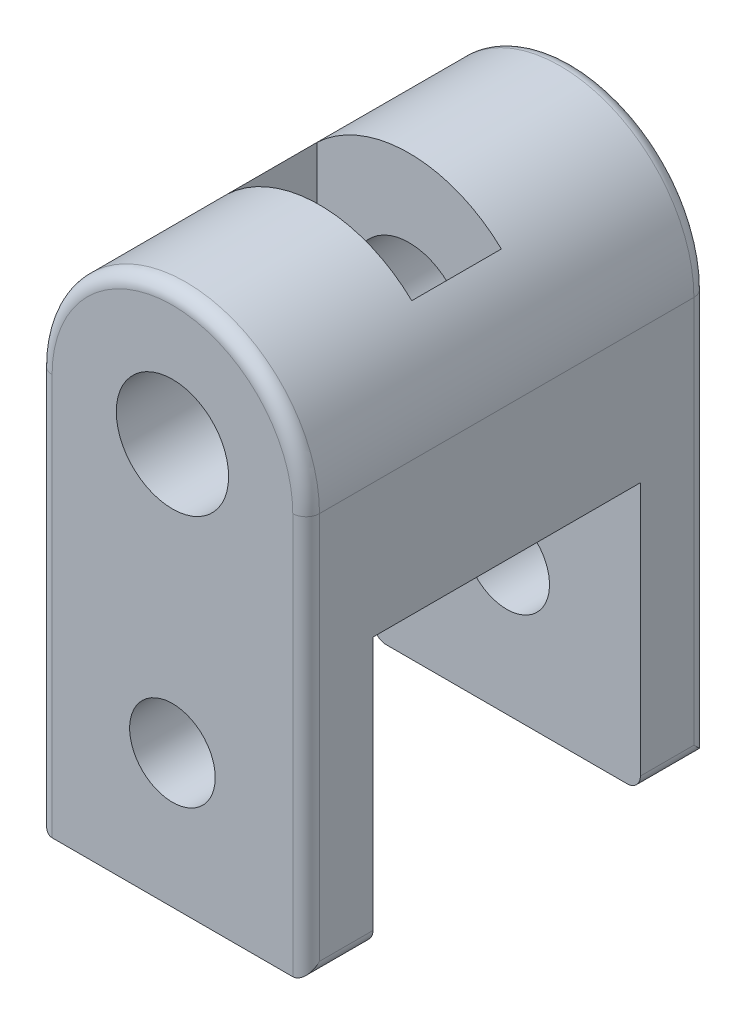
ISO-10303-21;
HEADER;
FILE_DESCRIPTION(('STEP AP214'),'2;1');
FILE_NAME('part.step','',(''),(''),'','','');
FILE_SCHEMA(('AUTOMOTIVE_DESIGN { 1 0 10303 214 1 1 1 1 }'));
ENDSEC;
DATA;
#1=APPLICATION_CONTEXT('core data for automotive mechanical design processes');
#2=APPLICATION_PROTOCOL_DEFINITION('international standard','automotive_design',2000,#1);
#3=PRODUCT_CONTEXT('',#1,'mechanical');
#4=PRODUCT('Part','Part','',(#3));
#5=PRODUCT_RELATED_PRODUCT_CATEGORY('part','',(#4));
#6=PRODUCT_DEFINITION_FORMATION('','',#4);
#7=PRODUCT_DEFINITION_CONTEXT('part definition',#1,'design');
#8=PRODUCT_DEFINITION('design','',#6,#7);
#9=PRODUCT_DEFINITION_SHAPE('','',#8);
#10=(LENGTH_UNIT() NAMED_UNIT(*) SI_UNIT(.MILLI.,.METRE.));
#11=(NAMED_UNIT(*) PLANE_ANGLE_UNIT() SI_UNIT($,.RADIAN.));
#12=(NAMED_UNIT(*) SI_UNIT($,.STERADIAN.) SOLID_ANGLE_UNIT());
#13=UNCERTAINTY_MEASURE_WITH_UNIT(LENGTH_MEASURE(1.E-05),#10,'distance_accuracy_value','');
#14=(GEOMETRIC_REPRESENTATION_CONTEXT(3) GLOBAL_UNCERTAINTY_ASSIGNED_CONTEXT((#13)) GLOBAL_UNIT_ASSIGNED_CONTEXT((#10,
#11,#12)) REPRESENTATION_CONTEXT('',''));
#15=CARTESIAN_POINT('',(0.,0.,0.));
#16=DIRECTION('',(0.,0.,1.));
#17=DIRECTION('',(1.,0.,0.));
#18=AXIS2_PLACEMENT_3D('',#15,#16,#17);
#19=CARTESIAN_POINT('',(6.89726919179015,16.0135523343817,-20.));
#20=DIRECTION('',(0.5,-0.866025403784439,0.));
#21=DIRECTION('',(0.866025403784439,0.5,0.));
#22=AXIS2_PLACEMENT_3D('',#19,#20,#21);
#23=PLANE('',#22);
#24=DIRECTION('',(-0.866025403784439,-0.5,0.));
#25=VECTOR('',#24,1.);
#26=CARTESIAN_POINT('',(-0.00273080820985521,12.0298354769733,-12.7));
#27=LINE('',#26,#25);
#28=CARTESIAN_POINT('',(6.89726919179015,16.0135523343817,-12.7));
#29=VERTEX_POINT('',#28);
#30=CARTESIAN_POINT('',(-0.00273080820985521,12.0298354769733,-12.7));
#31=VERTEX_POINT('',#30);
#32=EDGE_CURVE('E172',#29,#31,#27,.T.);
#33=ORIENTED_EDGE('',*,*,#32,.T.);
#34=DIRECTION('',(0.,0.,1.));
#35=VECTOR('',#34,1.);
#36=CARTESIAN_POINT('',(-0.00273080820985521,12.0298354769733,-20.));
#37=LINE('',#36,#35);
#38=CARTESIAN_POINT('',(-0.00273080820985521,12.0298354769733,-6.));
#39=VERTEX_POINT('',#38);
#40=EDGE_CURVE('E346',#31,#39,#37,.T.);
#41=ORIENTED_EDGE('',*,*,#40,.T.);
#42=DIRECTION('',(-0.866025403784439,-0.5,0.));
#43=VECTOR('',#42,1.);
#44=CARTESIAN_POINT('',(6.89726919179015,16.0135523343817,-6.));
#45=LINE('',#44,#43);
#46=CARTESIAN_POINT('',(6.89726919179015,16.0135523343817,-6.));
#47=VERTEX_POINT('',#46);
#48=EDGE_CURVE('E194',#47,#39,#45,.T.);
#49=ORIENTED_EDGE('',*,*,#48,.F.);
#50=DIRECTION('',(0.,0.,1.));
#51=VECTOR('',#50,1.);
#52=CARTESIAN_POINT('',(6.89726919179015,16.0135523343817,-20.));
#53=LINE('',#52,#51);
#54=EDGE_CURVE('E187',#29,#47,#53,.T.);
#55=ORIENTED_EDGE('',*,*,#54,.F.);
#56=EDGE_LOOP('',(#33,#41,#49,#55));
#57=FACE_BOUND('',#56,.T.);
#58=ADVANCED_FACE('F40',(#57),#23,.F.);
#59=CARTESIAN_POINT('',(6.89726919179015,21.1181277925762,-20.));
#60=DIRECTION('',(1.,0.,0.));
#61=DIRECTION('',(0.,1.,0.));
#62=AXIS2_PLACEMENT_3D('',#59,#60,#61);
#63=PLANE('',#62);
#64=DIRECTION('',(0.,-1.,0.));
#65=VECTOR('',#64,1.);
#66=CARTESIAN_POINT('',(6.89726919179015,16.0135523343817,-12.7));
#67=LINE('',#66,#65);
#68=CARTESIAN_POINT('',(6.89726919179015,27.2353628634692,-12.7));
#69=VERTEX_POINT('',#68);
#70=EDGE_CURVE('E175',#69,#29,#67,.T.);
#71=ORIENTED_EDGE('',*,*,#70,.T.);
#72=ORIENTED_EDGE('',*,*,#54,.T.);
#73=DIRECTION('',(0.,-1.,0.));
#74=VECTOR('',#73,1.);
#75=CARTESIAN_POINT('',(6.89726919179015,27.2353628634692,-6.));
#76=LINE('',#75,#74);
#77=CARTESIAN_POINT('',(6.89726919179014,27.2353628634692,-6.));
#78=VERTEX_POINT('',#77);
#79=EDGE_CURVE('E339',#78,#47,#76,.T.);
#80=ORIENTED_EDGE('',*,*,#79,.F.);
#81=DIRECTION('',(0.,0.,1.));
#82=VECTOR('',#81,1.);
#83=CARTESIAN_POINT('',(6.89726919179015,27.2353628634692,-20.));
#84=LINE('',#83,#82);
#85=EDGE_CURVE('E189',#69,#78,#84,.T.);
#86=ORIENTED_EDGE('',*,*,#85,.F.);
#87=EDGE_LOOP('',(#71,#72,#80,#86));
#88=FACE_BOUND('',#87,.T.);
#89=ADVANCED_FACE('F185',(#88),#63,.F.);
#90=CARTESIAN_POINT('',(-6.90273080820986,16.0135523343817,-20.));
#91=DIRECTION('',(-1.,0.,0.));
#92=DIRECTION('',(0.,0.,1.));
#93=AXIS2_PLACEMENT_3D('',#90,#91,#92);
#94=PLANE('',#93);
#95=DIRECTION('',(0.,1.,0.));
#96=VECTOR('',#95,1.);
#97=CARTESIAN_POINT('',(-6.90273080820986,27.2353628634692,-12.7));
#98=LINE('',#97,#96);
#99=CARTESIAN_POINT('',(-6.90273080820986,16.0135523343817,-12.7));
#100=VERTEX_POINT('',#99);
#101=CARTESIAN_POINT('',(-6.90273080820986,27.2353628634692,-12.7));
#102=VERTEX_POINT('',#101);
#103=EDGE_CURVE('E407',#100,#102,#98,.T.);
#104=ORIENTED_EDGE('',*,*,#103,.T.);
#105=DIRECTION('',(0.,0.,1.));
#106=VECTOR('',#105,1.);
#107=CARTESIAN_POINT('',(-6.90273080820986,27.2353628634692,-20.));
#108=LINE('',#107,#106);
#109=CARTESIAN_POINT('',(-6.90273080820985,27.2353628634692,-6.));
#110=VERTEX_POINT('',#109);
#111=EDGE_CURVE('E352',#102,#110,#108,.T.);
#112=ORIENTED_EDGE('',*,*,#111,.T.);
#113=DIRECTION('',(0.,1.,0.));
#114=VECTOR('',#113,1.);
#115=CARTESIAN_POINT('',(-6.90273080820986,16.0135523343817,-6.));
#116=LINE('',#115,#114);
#117=CARTESIAN_POINT('',(-6.90273080820986,16.0135523343817,-6.));
#118=VERTEX_POINT('',#117);
#119=EDGE_CURVE('E333',#118,#110,#116,.T.);
#120=ORIENTED_EDGE('',*,*,#119,.F.);
#121=DIRECTION('',(0.,0.,1.));
#122=VECTOR('',#121,1.);
#123=CARTESIAN_POINT('',(-6.90273080820986,16.0135523343817,-20.));
#124=LINE('',#123,#122);
#125=EDGE_CURVE('E350',#100,#118,#124,.T.);
#126=ORIENTED_EDGE('',*,*,#125,.F.);
#127=EDGE_LOOP('',(#104,#112,#120,#126));
#128=FACE_BOUND('',#127,.T.);
#129=ADVANCED_FACE('F420',(#128),#94,.F.);
#130=CARTESIAN_POINT('',(-0.00273080820985521,12.0298354769733,-20.));
#131=DIRECTION('',(-0.5,-0.866025403784438,0.));
#132=DIRECTION('',(0.866025403784438,-0.5,0.));
#133=AXIS2_PLACEMENT_3D('',#130,#131,#132);
#134=PLANE('',#133);
#135=DIRECTION('',(-0.866025403784439,0.5,0.));
#136=VECTOR('',#135,1.);
#137=CARTESIAN_POINT('',(-6.90273080820986,16.0135523343817,-12.7));
#138=LINE('',#137,#136);
#139=EDGE_CURVE('E178',#31,#100,#138,.T.);
#140=ORIENTED_EDGE('',*,*,#139,.T.);
#141=ORIENTED_EDGE('',*,*,#125,.T.);
#142=DIRECTION('',(-0.866025403784438,0.5,0.));
#143=VECTOR('',#142,1.);
#144=CARTESIAN_POINT('',(-0.00273080820985521,12.0298354769733,-6.));
#145=LINE('',#144,#143);
#146=EDGE_CURVE('E329',#39,#118,#145,.T.);
#147=ORIENTED_EDGE('',*,*,#146,.F.);
#148=ORIENTED_EDGE('',*,*,#40,.F.);
#149=EDGE_LOOP('',(#140,#141,#147,#148));
#150=FACE_BOUND('',#149,.T.);
#151=ADVANCED_FACE('F417',(#150),#134,.F.);
#152=CARTESIAN_POINT('',(-0.00273080820985608,19.9972691917901,0.));
#153=DIRECTION('',(0.,0.,-1.));
#154=DIRECTION('',(-1.,0.,0.));
#155=AXIS2_PLACEMENT_3D('',#152,#153,#154);
#156=PLANE('',#155);
#157=DIRECTION('',(1.,0.,0.));
#158=VECTOR('',#157,1.);
#159=CARTESIAN_POINT('',(-10.0027308082099,-10.0027308082099,0.));
#160=LINE('',#159,#158);
#161=CARTESIAN_POINT('',(-9.00273080820986,-10.0027308082099,0.));
#162=VERTEX_POINT('',#161);
#163=CARTESIAN_POINT('',(8.99726919179015,-10.0027308082099,0.));
#164=VERTEX_POINT('',#163);
#165=EDGE_CURVE('E217',#162,#164,#160,.T.);
#166=ORIENTED_EDGE('',*,*,#165,.F.);
#167=CARTESIAN_POINT('',(-9.00273080820986,-9.00273080820986,0.));
#168=DIRECTION('',(0.,0.,-1.));
#169=DIRECTION('',(-1.,0.,0.));
#170=AXIS2_PLACEMENT_3D('',#167,#168,#169);
#171=CIRCLE('',#170,1.);
#172=CARTESIAN_POINT('',(-10.0027308082099,-9.00273080820986,0.));
#173=VERTEX_POINT('',#172);
#174=EDGE_CURVE('E13',#162,#173,#171,.T.);
#175=ORIENTED_EDGE('',*,*,#174,.T.);
#176=DIRECTION('',(0.,-1.,0.));
#177=VECTOR('',#176,1.);
#178=CARTESIAN_POINT('',(-10.0027308082099,-10.0027308082099,0.));
#179=LINE('',#178,#177);
#180=CARTESIAN_POINT('',(-10.0027308082099,9.99726919179014,0.));
#181=VERTEX_POINT('',#180);
#182=EDGE_CURVE('E209',#181,#173,#179,.T.);
#183=ORIENTED_EDGE('',*,*,#182,.F.);
#184=DIRECTION('',(-1.,0.,0.));
#185=VECTOR('',#184,1.);
#186=CARTESIAN_POINT('',(9.99726919179014,9.99726919179014,0.));
#187=LINE('',#186,#185);
#188=CARTESIAN_POINT('',(9.99726919179014,9.99726919179014,0.));
#189=VERTEX_POINT('',#188);
#190=EDGE_CURVE('E342',#189,#181,#187,.T.);
#191=ORIENTED_EDGE('',*,*,#190,.F.);
#192=DIRECTION('',(0.,1.,0.));
#193=VECTOR('',#192,1.);
#194=CARTESIAN_POINT('',(9.99726919179014,-10.0027308082099,0.));
#195=LINE('',#194,#193);
#196=CARTESIAN_POINT('',(9.99726919179014,-9.00273080820986,0.));
#197=VERTEX_POINT('',#196);
#198=EDGE_CURVE('E214',#197,#189,#195,.T.);
#199=ORIENTED_EDGE('',*,*,#198,.F.);
#200=CARTESIAN_POINT('',(8.99726919179015,-9.00273080820986,0.));
#201=DIRECTION('',(0.,0.,-1.));
#202=DIRECTION('',(-1.,0.,0.));
#203=AXIS2_PLACEMENT_3D('',#200,#201,#202);
#204=CIRCLE('',#203,1.);
#205=EDGE_CURVE('E49',#197,#164,#204,.T.);
#206=ORIENTED_EDGE('',*,*,#205,.T.);
#207=EDGE_LOOP('',(#166,#175,#183,#191,#199,#206));
#208=FACE_BOUND('',#207,.T.);
#209=CARTESIAN_POINT('',(-0.00273080820986128,-0.00273080820986128,0.));
#210=DIRECTION('',(0.,0.,1.));
#211=DIRECTION('',(1.,0.,0.));
#212=AXIS2_PLACEMENT_3D('',#209,#210,#211);
#213=CIRCLE('',#212,3.2);
#214=CARTESIAN_POINT('',(3.19726919179014,-0.00273080820986128,0.));
#215=VERTEX_POINT('',#214);
#216=EDGE_CURVE('E195',#215,#215,#213,.T.);
#217=ORIENTED_EDGE('',*,*,#216,.T.);
#218=EDGE_LOOP('',(#217));
#219=FACE_BOUND('',#218,.T.);
#220=ADVANCED_FACE('F366',(#208,#219),#156,.T.);
#221=CARTESIAN_POINT('',(-0.00273080820985608,19.9972691917901,5.));
#222=DIRECTION('',(0.,0.,-1.));
#223=DIRECTION('',(-1.,0.,0.));
#224=AXIS2_PLACEMENT_3D('',#221,#222,#223);
#225=PLANE('',#224);
#226=DIRECTION('',(1.,0.,0.));
#227=VECTOR('',#226,1.);
#228=CARTESIAN_POINT('',(-10.0027308082099,-10.0027308082099,5.));
#229=LINE('',#228,#227);
#230=CARTESIAN_POINT('',(-9.00273080820986,-10.0027308082099,5.));
#231=VERTEX_POINT('',#230);
#232=CARTESIAN_POINT('',(8.99726919179015,-10.0027308082099,5.));
#233=VERTEX_POINT('',#232);
#234=EDGE_CURVE('E210',#231,#233,#229,.T.);
#235=ORIENTED_EDGE('',*,*,#234,.T.);
#236=DIRECTION('',(0.,1.,0.));
#237=VECTOR('',#236,1.);
#238=CARTESIAN_POINT('',(8.99726919179015,19.9972691917901,5.));
#239=LINE('',#238,#237);
#240=CARTESIAN_POINT('',(8.99726919179015,19.9972691917901,5.));
#241=VERTEX_POINT('',#240);
#242=EDGE_CURVE('E229',#233,#241,#239,.T.);
#243=ORIENTED_EDGE('',*,*,#242,.T.);
#244=CARTESIAN_POINT('',(-0.00273080820985608,19.9972691917901,5.));
#245=DIRECTION('',(0.,0.,-1.));
#246=DIRECTION('',(-1.,0.,0.));
#247=AXIS2_PLACEMENT_3D('',#244,#245,#246);
#248=CIRCLE('',#247,9.);
#249=CARTESIAN_POINT('',(-9.00273080820986,19.9972691917901,5.));
#250=VERTEX_POINT('',#249);
#251=EDGE_CURVE('E225',#241,#250,#248,.F.);
#252=ORIENTED_EDGE('',*,*,#251,.T.);
#253=DIRECTION('',(0.,-1.,0.));
#254=VECTOR('',#253,1.);
#255=CARTESIAN_POINT('',(-9.00273080820986,19.9972691917901,5.));
#256=LINE('',#255,#254);
#257=EDGE_CURVE('E227',#250,#231,#256,.T.);
#258=ORIENTED_EDGE('',*,*,#257,.T.);
#259=EDGE_LOOP('',(#235,#243,#252,#258));
#260=FACE_BOUND('',#259,.T.);
#261=CARTESIAN_POINT('',(-0.00273080820985608,19.9972691917901,5.));
#262=DIRECTION('',(0.,0.,1.));
#263=DIRECTION('',(1.,0.,0.));
#264=AXIS2_PLACEMENT_3D('',#261,#262,#263);
#265=CIRCLE('',#264,4.2);
#266=CARTESIAN_POINT('',(4.19726919179015,19.9972691917901,5.));
#267=VERTEX_POINT('',#266);
#268=EDGE_CURVE('E205',#267,#267,#265,.T.);
#269=ORIENTED_EDGE('',*,*,#268,.F.);
#270=EDGE_LOOP('',(#269));
#271=FACE_BOUND('',#270,.T.);
#272=CARTESIAN_POINT('',(-0.00273080820986128,-0.00273080820986128,5.));
#273=DIRECTION('',(0.,0.,1.));
#274=DIRECTION('',(1.,0.,0.));
#275=AXIS2_PLACEMENT_3D('',#272,#273,#274);
#276=CIRCLE('',#275,3.2);
#277=CARTESIAN_POINT('',(3.19726919179014,-0.00273080820986128,5.));
#278=VERTEX_POINT('',#277);
#279=EDGE_CURVE('E198',#278,#278,#276,.T.);
#280=ORIENTED_EDGE('',*,*,#279,.F.);
#281=EDGE_LOOP('',(#280));
#282=FACE_BOUND('',#281,.T.);
#283=ADVANCED_FACE('F450',(#260,#271,#282),#225,.F.);
#284=CARTESIAN_POINT('',(-10.0027308082099,-10.0027308082099,5.));
#285=DIRECTION('',(1.,0.,0.));
#286=DIRECTION('',(0.,0.,-1.));
#287=AXIS2_PLACEMENT_3D('',#284,#285,#286);
#288=PLANE('',#287);
#289=DIRECTION('',(0.,0.,-1.));
#290=VECTOR('',#289,1.);
#291=CARTESIAN_POINT('',(-10.0027308082099,19.9972691917901,5.));
#292=LINE('',#291,#290);
#293=CARTESIAN_POINT('',(-10.0027308082099,19.9972691917901,4.));
#294=VERTEX_POINT('',#293);
#295=CARTESIAN_POINT('',(-10.0027308082099,19.9972691917901,-24.));
#296=VERTEX_POINT('',#295);
#297=EDGE_CURVE('E213',#294,#296,#292,.T.);
#298=ORIENTED_EDGE('',*,*,#297,.T.);
#299=DIRECTION('',(0.,1.,0.));
#300=VECTOR('',#299,1.);
#301=CARTESIAN_POINT('',(-10.0027308082099,-10.0027308082099,-24.));
#302=LINE('',#301,#300);
#303=CARTESIAN_POINT('',(-10.0027308082099,-9.00273080820986,-24.));
#304=VERTEX_POINT('',#303);
#305=EDGE_CURVE('E246',#296,#304,#302,.F.);
#306=ORIENTED_EDGE('',*,*,#305,.T.);
#307=DIRECTION('',(0.,0.,1.));
#308=VECTOR('',#307,1.);
#309=CARTESIAN_POINT('',(-10.0027308082099,-9.00273080820986,5.));
#310=LINE('',#309,#308);
#311=CARTESIAN_POINT('',(-10.0027308082099,-9.00273080820986,-20.));
#312=VERTEX_POINT('',#311);
#313=EDGE_CURVE('E244',#304,#312,#310,.T.);
#314=ORIENTED_EDGE('',*,*,#313,.T.);
#315=DIRECTION('',(0.,1.,0.));
#316=VECTOR('',#315,1.);
#317=CARTESIAN_POINT('',(-10.0027308082099,0.,-20.));
#318=LINE('',#317,#316);
#319=CARTESIAN_POINT('',(-10.0027308082099,9.99726919179014,-20.));
#320=VERTEX_POINT('',#319);
#321=EDGE_CURVE('E322',#312,#320,#318,.T.);
#322=ORIENTED_EDGE('',*,*,#321,.T.);
#323=DIRECTION('',(0.,0.,1.));
#324=VECTOR('',#323,1.);
#325=CARTESIAN_POINT('',(-10.0027308082099,9.99726919179014,-20.));
#326=LINE('',#325,#324);
#327=EDGE_CURVE('E354',#320,#181,#326,.T.);
#328=ORIENTED_EDGE('',*,*,#327,.T.);
#329=ORIENTED_EDGE('',*,*,#182,.T.);
#330=DIRECTION('',(0.,0.,-1.));
#331=VECTOR('',#330,1.);
#332=CARTESIAN_POINT('',(-10.0027308082099,-9.00273080820986,5.));
#333=LINE('',#332,#331);
#334=CARTESIAN_POINT('',(-10.0027308082099,-9.00273080820986,4.));
#335=VERTEX_POINT('',#334);
#336=EDGE_CURVE('E240',#173,#335,#333,.F.);
#337=ORIENTED_EDGE('',*,*,#336,.T.);
#338=DIRECTION('',(0.,-1.,0.));
#339=VECTOR('',#338,1.);
#340=CARTESIAN_POINT('',(-10.0027308082099,-10.0027308082099,4.));
#341=LINE('',#340,#339);
#342=EDGE_CURVE('E242',#335,#294,#341,.F.);
#343=ORIENTED_EDGE('',*,*,#342,.T.);
#344=EDGE_LOOP('',(#298,#306,#314,#322,#328,#329,#337,#343));
#345=FACE_BOUND('',#344,.T.);
#346=ADVANCED_FACE('F371',(#345),#288,.F.);
#347=CARTESIAN_POINT('',(-10.0027308082099,-10.0027308082099,5.));
#348=DIRECTION('',(0.,1.,0.));
#349=DIRECTION('',(-1.,0.,0.));
#350=AXIS2_PLACEMENT_3D('',#347,#348,#349);
#351=PLANE('',#350);
#352=ORIENTED_EDGE('',*,*,#234,.F.);
#353=DIRECTION('',(0.,0.,-1.));
#354=VECTOR('',#353,1.);
#355=CARTESIAN_POINT('',(-9.00273080820986,-10.0027308082099,5.));
#356=LINE('',#355,#354);
#357=EDGE_CURVE('E63',#231,#162,#356,.T.);
#358=ORIENTED_EDGE('',*,*,#357,.T.);
#359=ORIENTED_EDGE('',*,*,#165,.T.);
#360=DIRECTION('',(0.,0.,-1.));
#361=VECTOR('',#360,1.);
#362=CARTESIAN_POINT('',(8.99726919179015,-10.0027308082099,5.));
#363=LINE('',#362,#361);
#364=EDGE_CURVE('E267',#164,#233,#363,.F.);
#365=ORIENTED_EDGE('',*,*,#364,.T.);
#366=EDGE_LOOP('',(#352,#358,#359,#365));
#367=FACE_BOUND('',#366,.T.);
#368=ADVANCED_FACE('F436',(#367),#351,.F.);
#369=CARTESIAN_POINT('',(9.99726919179014,-10.0027308082099,5.));
#370=DIRECTION('',(-1.,0.,0.));
#371=DIRECTION('',(0.,0.,1.));
#372=AXIS2_PLACEMENT_3D('',#369,#370,#371);
#373=PLANE('',#372);
#374=DIRECTION('',(0.,0.,-1.));
#375=VECTOR('',#374,1.);
#376=CARTESIAN_POINT('',(9.99726919179014,19.9972691917901,5.));
#377=LINE('',#376,#375);
#378=CARTESIAN_POINT('',(9.99726919179014,19.9972691917901,4.));
#379=VERTEX_POINT('',#378);
#380=CARTESIAN_POINT('',(9.99726919179014,19.9972691917901,-24.));
#381=VERTEX_POINT('',#380);
#382=EDGE_CURVE('E222',#379,#381,#377,.T.);
#383=ORIENTED_EDGE('',*,*,#382,.F.);
#384=DIRECTION('',(0.,1.,0.));
#385=VECTOR('',#384,1.);
#386=CARTESIAN_POINT('',(9.99726919179014,-10.0027308082099,4.));
#387=LINE('',#386,#385);
#388=CARTESIAN_POINT('',(9.99726919179014,-9.00273080820986,4.));
#389=VERTEX_POINT('',#388);
#390=EDGE_CURVE('E238',#379,#389,#387,.F.);
#391=ORIENTED_EDGE('',*,*,#390,.T.);
#392=DIRECTION('',(0.,0.,-1.));
#393=VECTOR('',#392,1.);
#394=CARTESIAN_POINT('',(9.99726919179014,-9.00273080820986,5.));
#395=LINE('',#394,#393);
#396=EDGE_CURVE('E236',#389,#197,#395,.T.);
#397=ORIENTED_EDGE('',*,*,#396,.T.);
#398=ORIENTED_EDGE('',*,*,#198,.T.);
#399=DIRECTION('',(0.,0.,1.));
#400=VECTOR('',#399,1.);
#401=CARTESIAN_POINT('',(9.99726919179014,9.99726919179014,-20.));
#402=LINE('',#401,#400);
#403=CARTESIAN_POINT('',(9.99726919179014,9.99726919179014,-20.));
#404=VERTEX_POINT('',#403);
#405=EDGE_CURVE('E200',#404,#189,#402,.T.);
#406=ORIENTED_EDGE('',*,*,#405,.F.);
#407=DIRECTION('',(0.,-1.,0.));
#408=VECTOR('',#407,1.);
#409=CARTESIAN_POINT('',(9.99726919179014,0.,-20.));
#410=LINE('',#409,#408);
#411=CARTESIAN_POINT('',(9.99726919179014,-9.00273080820986,-20.));
#412=VERTEX_POINT('',#411);
#413=EDGE_CURVE('E318',#404,#412,#410,.T.);
#414=ORIENTED_EDGE('',*,*,#413,.T.);
#415=DIRECTION('',(0.,0.,1.));
#416=VECTOR('',#415,1.);
#417=CARTESIAN_POINT('',(9.99726919179014,-9.00273080820986,5.));
#418=LINE('',#417,#416);
#419=CARTESIAN_POINT('',(9.99726919179014,-9.00273080820986,-24.));
#420=VERTEX_POINT('',#419);
#421=EDGE_CURVE('E232',#412,#420,#418,.F.);
#422=ORIENTED_EDGE('',*,*,#421,.T.);
#423=DIRECTION('',(0.,-1.,0.));
#424=VECTOR('',#423,1.);
#425=CARTESIAN_POINT('',(9.99726919179014,19.9972691917901,-24.));
#426=LINE('',#425,#424);
#427=EDGE_CURVE('E234',#420,#381,#426,.F.);
#428=ORIENTED_EDGE('',*,*,#427,.T.);
#429=EDGE_LOOP('',(#383,#391,#397,#398,#406,#414,#422,#428));
#430=FACE_BOUND('',#429,.T.);
#431=ADVANCED_FACE('F364',(#430),#373,.F.);
#432=CARTESIAN_POINT('',(-0.00273080820985608,19.9972691917901,5.));
#433=DIRECTION('',(0.,0.,-1.));
#434=DIRECTION('',(-1.,0.,0.));
#435=AXIS2_PLACEMENT_3D('',#432,#433,#434);
#436=CYLINDRICAL_SURFACE('',#435,10.);
#437=CARTESIAN_POINT('',(-0.00273080820985608,19.9972691917901,-12.7));
#438=DIRECTION('',(0.,0.,-1.));
#439=DIRECTION('',(-1.,0.,0.));
#440=AXIS2_PLACEMENT_3D('',#437,#438,#439);
#441=CIRCLE('',#440,10.);
#442=EDGE_CURVE('E190',#102,#69,#441,.T.);
#443=ORIENTED_EDGE('',*,*,#442,.T.);
#444=ORIENTED_EDGE('',*,*,#85,.T.);
#445=CARTESIAN_POINT('',(-0.00273080820985608,19.9972691917901,-6.));
#446=DIRECTION('',(0.,0.,-1.));
#447=DIRECTION('',(-1.,0.,0.));
#448=AXIS2_PLACEMENT_3D('',#445,#446,#447);
#449=CIRCLE('',#448,10.);
#450=EDGE_CURVE('E336',#110,#78,#449,.T.);
#451=ORIENTED_EDGE('',*,*,#450,.F.);
#452=ORIENTED_EDGE('',*,*,#111,.F.);
#453=EDGE_LOOP('',(#443,#444,#451,#452));
#454=FACE_BOUND('',#453,.T.);
#455=ORIENTED_EDGE('',*,*,#297,.F.);
#456=CARTESIAN_POINT('',(-0.00273080820985608,19.9972691917901,4.));
#457=DIRECTION('',(0.,0.,-1.));
#458=DIRECTION('',(-1.,0.,0.));
#459=AXIS2_PLACEMENT_3D('',#456,#457,#458);
#460=CIRCLE('',#459,10.);
#461=EDGE_CURVE('E257',#294,#379,#460,.T.);
#462=ORIENTED_EDGE('',*,*,#461,.T.);
#463=ORIENTED_EDGE('',*,*,#382,.T.);
#464=CARTESIAN_POINT('',(-0.00273080820985608,19.9972691917901,-24.));
#465=DIRECTION('',(0.,0.,-1.));
#466=DIRECTION('',(-1.,0.,0.));
#467=AXIS2_PLACEMENT_3D('',#464,#465,#466);
#468=CIRCLE('',#467,10.);
#469=EDGE_CURVE('E255',#381,#296,#468,.F.);
#470=ORIENTED_EDGE('',*,*,#469,.T.);
#471=EDGE_LOOP('',(#455,#462,#463,#470));
#472=FACE_BOUND('',#471,.T.);
#473=ADVANCED_FACE('F384',(#454,#472),#436,.T.);
#474=CARTESIAN_POINT('',(-0.00273080820985608,19.9972691917901,5.));
#475=DIRECTION('',(0.,0.,-1.));
#476=DIRECTION('',(-1.,0.,0.));
#477=AXIS2_PLACEMENT_3D('',#474,#475,#476);
#478=CYLINDRICAL_SURFACE('',#477,4.2);
#479=ORIENTED_EDGE('',*,*,#268,.T.);
#480=EDGE_LOOP('',(#479));
#481=FACE_BOUND('',#480,.T.);
#482=CARTESIAN_POINT('',(-0.00273080820985608,19.9972691917901,-6.));
#483=DIRECTION('',(0.,0.,-1.));
#484=DIRECTION('',(-1.,0.,0.));
#485=AXIS2_PLACEMENT_3D('',#482,#483,#484);
#486=CIRCLE('',#485,4.2);
#487=CARTESIAN_POINT('',(-4.20273080820986,19.9972691917901,-6.));
#488=VERTEX_POINT('',#487);
#489=EDGE_CURVE('E326',#488,#488,#486,.T.);
#490=ORIENTED_EDGE('',*,*,#489,.T.);
#491=EDGE_LOOP('',(#490));
#492=FACE_BOUND('',#491,.T.);
#493=ADVANCED_FACE('F427',(#481,#492),#478,.F.);
#494=CARTESIAN_POINT('',(-0.00273080820986128,-0.00273080820986128,5.));
#495=DIRECTION('',(0.,0.,-1.));
#496=DIRECTION('',(-1.,0.,0.));
#497=AXIS2_PLACEMENT_3D('',#494,#495,#496);
#498=CYLINDRICAL_SURFACE('',#497,3.2);
#499=ORIENTED_EDGE('',*,*,#279,.T.);
#500=EDGE_LOOP('',(#499));
#501=FACE_BOUND('',#500,.T.);
#502=ORIENTED_EDGE('',*,*,#216,.F.);
#503=EDGE_LOOP('',(#502));
#504=FACE_BOUND('',#503,.T.);
#505=ADVANCED_FACE('F433',(#501,#504),#498,.F.);
#506=CARTESIAN_POINT('',(9.99726919179014,9.99726919179014,-20.));
#507=DIRECTION('',(0.,1.,0.));
#508=DIRECTION('',(-1.,0.,0.));
#509=AXIS2_PLACEMENT_3D('',#506,#507,#508);
#510=PLANE('',#509);
#511=ORIENTED_EDGE('',*,*,#190,.T.);
#512=ORIENTED_EDGE('',*,*,#327,.F.);
#513=DIRECTION('',(-1.,0.,0.));
#514=VECTOR('',#513,1.);
#515=CARTESIAN_POINT('',(9.99726919179014,9.99726919179014,-20.));
#516=LINE('',#515,#514);
#517=EDGE_CURVE('E343',#404,#320,#516,.T.);
#518=ORIENTED_EDGE('',*,*,#517,.F.);
#519=ORIENTED_EDGE('',*,*,#405,.T.);
#520=EDGE_LOOP('',(#511,#512,#518,#519));
#521=FACE_BOUND('',#520,.T.);
#522=ADVANCED_FACE('F359',(#521),#510,.F.);
#523=CARTESIAN_POINT('',(-0.00273080820985608,19.9972691917901,-6.));
#524=DIRECTION('',(0.,0.,-1.));
#525=DIRECTION('',(-1.,0.,0.));
#526=AXIS2_PLACEMENT_3D('',#523,#524,#525);
#527=PLANE('',#526);
#528=ORIENTED_EDGE('',*,*,#146,.T.);
#529=ORIENTED_EDGE('',*,*,#119,.T.);
#530=ORIENTED_EDGE('',*,*,#450,.T.);
#531=ORIENTED_EDGE('',*,*,#79,.T.);
#532=ORIENTED_EDGE('',*,*,#48,.T.);
#533=EDGE_LOOP('',(#528,#529,#530,#531,#532));
#534=FACE_BOUND('',#533,.T.);
#535=ORIENTED_EDGE('',*,*,#489,.F.);
#536=EDGE_LOOP('',(#535));
#537=FACE_BOUND('',#536,.T.);
#538=ADVANCED_FACE('F423',(#534,#537),#527,.T.);
#539=CARTESIAN_POINT('',(0.,0.,-20.));
#540=DIRECTION('',(0.,0.,-1.));
#541=DIRECTION('',(-1.,0.,0.));
#542=AXIS2_PLACEMENT_3D('',#539,#540,#541);
#543=PLANE('',#542);
#544=CARTESIAN_POINT('',(-0.00273080820986128,-0.00273080820986128,-20.));
#545=DIRECTION('',(0.,0.,-1.));
#546=DIRECTION('',(-1.,0.,0.));
#547=AXIS2_PLACEMENT_3D('',#544,#545,#546);
#548=CIRCLE('',#547,3.2);
#549=CARTESIAN_POINT('',(-3.20273080820986,-0.00273080820986128,-20.));
#550=VERTEX_POINT('',#549);
#551=EDGE_CURVE('E317',#550,#550,#548,.T.);
#552=ORIENTED_EDGE('',*,*,#551,.T.);
#553=EDGE_LOOP('',(#552));
#554=FACE_BOUND('',#553,.T.);
#555=ORIENTED_EDGE('',*,*,#321,.F.);
#556=CARTESIAN_POINT('',(-9.00273080820986,-9.00273080820986,-20.));
#557=DIRECTION('',(0.,0.,-1.));
#558=DIRECTION('',(-1.,0.,0.));
#559=AXIS2_PLACEMENT_3D('',#556,#557,#558);
#560=CIRCLE('',#559,1.);
#561=CARTESIAN_POINT('',(-9.00273080820986,-10.0027308082099,-20.));
#562=VERTEX_POINT('',#561);
#563=EDGE_CURVE('E261',#312,#562,#560,.F.);
#564=ORIENTED_EDGE('',*,*,#563,.T.);
#565=DIRECTION('',(-1.,0.,0.));
#566=VECTOR('',#565,1.);
#567=CARTESIAN_POINT('',(0.,-10.0027308082099,-20.));
#568=LINE('',#567,#566);
#569=CARTESIAN_POINT('',(8.99726919179015,-10.0027308082099,-20.));
#570=VERTEX_POINT('',#569);
#571=EDGE_CURVE('E307',#570,#562,#568,.T.);
#572=ORIENTED_EDGE('',*,*,#571,.F.);
#573=CARTESIAN_POINT('',(8.99726919179015,-9.00273080820986,-20.));
#574=DIRECTION('',(0.,0.,-1.));
#575=DIRECTION('',(-1.,0.,0.));
#576=AXIS2_PLACEMENT_3D('',#573,#574,#575);
#577=CIRCLE('',#576,1.);
#578=EDGE_CURVE('E259',#570,#412,#577,.F.);
#579=ORIENTED_EDGE('',*,*,#578,.T.);
#580=ORIENTED_EDGE('',*,*,#413,.F.);
#581=ORIENTED_EDGE('',*,*,#517,.T.);
#582=EDGE_LOOP('',(#555,#564,#572,#579,#580,#581));
#583=FACE_BOUND('',#582,.T.);
#584=ADVANCED_FACE('F313',(#554,#583),#543,.F.);
#585=CARTESIAN_POINT('',(-0.00273080820985608,19.9972691917901,-25.));
#586=DIRECTION('',(0.,0.,1.));
#587=DIRECTION('',(1.,0.,0.));
#588=AXIS2_PLACEMENT_3D('',#585,#586,#587);
#589=CYLINDRICAL_SURFACE('',#588,4.2);
#590=CARTESIAN_POINT('',(-0.00273080820985608,19.9972691917901,-25.));
#591=DIRECTION('',(0.,0.,-1.));
#592=DIRECTION('',(-1.,0.,0.));
#593=AXIS2_PLACEMENT_3D('',#590,#591,#592);
#594=CIRCLE('',#593,4.2);
#595=CARTESIAN_POINT('',(-4.20273080820986,19.9972691917901,-25.));
#596=VERTEX_POINT('',#595);
#597=EDGE_CURVE('E397',#596,#596,#594,.T.);
#598=ORIENTED_EDGE('',*,*,#597,.T.);
#599=EDGE_LOOP('',(#598));
#600=FACE_BOUND('',#599,.T.);
#601=CARTESIAN_POINT('',(-0.00273080820985608,19.9972691917901,-12.7));
#602=DIRECTION('',(0.,0.,-1.));
#603=DIRECTION('',(-1.,0.,0.));
#604=AXIS2_PLACEMENT_3D('',#601,#602,#603);
#605=CIRCLE('',#604,4.2);
#606=CARTESIAN_POINT('',(-4.20273080820986,19.9972691917901,-12.7));
#607=VERTEX_POINT('',#606);
#608=EDGE_CURVE('E402',#607,#607,#605,.T.);
#609=ORIENTED_EDGE('',*,*,#608,.F.);
#610=EDGE_LOOP('',(#609));
#611=FACE_BOUND('',#610,.T.);
#612=ADVANCED_FACE('F471',(#600,#611),#589,.F.);
#613=CARTESIAN_POINT('',(0.,-10.0027308082099,-25.));
#614=DIRECTION('',(0.,1.,0.));
#615=DIRECTION('',(0.,0.,1.));
#616=AXIS2_PLACEMENT_3D('',#613,#614,#615);
#617=PLANE('',#616);
#618=ORIENTED_EDGE('',*,*,#571,.T.);
#619=DIRECTION('',(0.,0.,1.));
#620=VECTOR('',#619,1.);
#621=CARTESIAN_POINT('',(-9.00273080820986,-10.0027308082099,-25.));
#622=LINE('',#621,#620);
#623=CARTESIAN_POINT('',(-9.00273080820986,-10.0027308082099,-25.));
#624=VERTEX_POINT('',#623);
#625=EDGE_CURVE('E265',#562,#624,#622,.F.);
#626=ORIENTED_EDGE('',*,*,#625,.T.);
#627=DIRECTION('',(-1.,0.,0.));
#628=VECTOR('',#627,1.);
#629=CARTESIAN_POINT('',(0.,-10.0027308082099,-25.));
#630=LINE('',#629,#628);
#631=CARTESIAN_POINT('',(8.99726919179015,-10.0027308082099,-25.));
#632=VERTEX_POINT('',#631);
#633=EDGE_CURVE('E310',#632,#624,#630,.T.);
#634=ORIENTED_EDGE('',*,*,#633,.F.);
#635=DIRECTION('',(0.,0.,1.));
#636=VECTOR('',#635,1.);
#637=CARTESIAN_POINT('',(8.99726919179015,-10.0027308082099,-25.));
#638=LINE('',#637,#636);
#639=EDGE_CURVE('E263',#632,#570,#638,.T.);
#640=ORIENTED_EDGE('',*,*,#639,.T.);
#641=EDGE_LOOP('',(#618,#626,#634,#640));
#642=FACE_BOUND('',#641,.T.);
#643=ADVANCED_FACE('F306',(#642),#617,.F.);
#644=CARTESIAN_POINT('',(-0.00273080820986128,-0.00273080820986128,-25.));
#645=DIRECTION('',(0.,0.,1.));
#646=DIRECTION('',(1.,0.,0.));
#647=AXIS2_PLACEMENT_3D('',#644,#645,#646);
#648=CYLINDRICAL_SURFACE('',#647,3.2);
#649=CARTESIAN_POINT('',(-0.00273080820986128,-0.00273080820986128,-25.));
#650=DIRECTION('',(0.,0.,-1.));
#651=DIRECTION('',(-1.,0.,0.));
#652=AXIS2_PLACEMENT_3D('',#649,#650,#651);
#653=CIRCLE('',#652,3.2);
#654=CARTESIAN_POINT('',(-3.20273080820986,-0.00273080820986128,-25.));
#655=VERTEX_POINT('',#654);
#656=EDGE_CURVE('E330',#655,#655,#653,.T.);
#657=ORIENTED_EDGE('',*,*,#656,.T.);
#658=EDGE_LOOP('',(#657));
#659=FACE_BOUND('',#658,.T.);
#660=ORIENTED_EDGE('',*,*,#551,.F.);
#661=EDGE_LOOP('',(#660));
#662=FACE_BOUND('',#661,.T.);
#663=ADVANCED_FACE('F482',(#659,#662),#648,.F.);
#664=CARTESIAN_POINT('',(0.,0.,-25.));
#665=DIRECTION('',(0.,0.,-1.));
#666=DIRECTION('',(-1.,0.,0.));
#667=AXIS2_PLACEMENT_3D('',#664,#665,#666);
#668=PLANE('',#667);
#669=ORIENTED_EDGE('',*,*,#633,.T.);
#670=DIRECTION('',(0.,1.,0.));
#671=VECTOR('',#670,1.);
#672=CARTESIAN_POINT('',(-9.00273080820986,19.9972691917901,-25.));
#673=LINE('',#672,#671);
#674=CARTESIAN_POINT('',(-9.00273080820986,19.9972691917901,-25.));
#675=VERTEX_POINT('',#674);
#676=EDGE_CURVE('E252',#624,#675,#673,.T.);
#677=ORIENTED_EDGE('',*,*,#676,.T.);
#678=CARTESIAN_POINT('',(-0.00273080820985608,19.9972691917901,-25.));
#679=DIRECTION('',(0.,0.,-1.));
#680=DIRECTION('',(-1.,0.,0.));
#681=AXIS2_PLACEMENT_3D('',#678,#679,#680);
#682=CIRCLE('',#681,9.);
#683=CARTESIAN_POINT('',(8.99726919179015,19.9972691917901,-25.));
#684=VERTEX_POINT('',#683);
#685=EDGE_CURVE('E248',#675,#684,#682,.T.);
#686=ORIENTED_EDGE('',*,*,#685,.T.);
#687=DIRECTION('',(0.,-1.,0.));
#688=VECTOR('',#687,1.);
#689=CARTESIAN_POINT('',(8.99726919179015,-10.0027308082099,-25.));
#690=LINE('',#689,#688);
#691=EDGE_CURVE('E250',#684,#632,#690,.T.);
#692=ORIENTED_EDGE('',*,*,#691,.T.);
#693=EDGE_LOOP('',(#669,#677,#686,#692));
#694=FACE_BOUND('',#693,.T.);
#695=ORIENTED_EDGE('',*,*,#597,.F.);
#696=EDGE_LOOP('',(#695));
#697=FACE_BOUND('',#696,.T.);
#698=ORIENTED_EDGE('',*,*,#656,.F.);
#699=EDGE_LOOP('',(#698));
#700=FACE_BOUND('',#699,.T.);
#701=ADVANCED_FACE('F395',(#694,#697,#700),#668,.T.);
#702=CARTESIAN_POINT('',(-0.00273080820985608,19.9972691917901,-12.7));
#703=DIRECTION('',(0.,0.,-1.));
#704=DIRECTION('',(-1.,0.,0.));
#705=AXIS2_PLACEMENT_3D('',#702,#703,#704);
#706=PLANE('',#705);
#707=ORIENTED_EDGE('',*,*,#608,.T.);
#708=EDGE_LOOP('',(#707));
#709=FACE_BOUND('',#708,.T.);
#710=ORIENTED_EDGE('',*,*,#32,.F.);
#711=ORIENTED_EDGE('',*,*,#70,.F.);
#712=ORIENTED_EDGE('',*,*,#442,.F.);
#713=ORIENTED_EDGE('',*,*,#103,.F.);
#714=ORIENTED_EDGE('',*,*,#139,.F.);
#715=EDGE_LOOP('',(#710,#711,#712,#713,#714));
#716=FACE_BOUND('',#715,.T.);
#717=ADVANCED_FACE('F174',(#709,#716),#706,.F.);
#718=CARTESIAN_POINT('',(-9.00273080820986,-9.00273080820986,5.));
#719=DIRECTION('',(0.,0.,-1.));
#720=DIRECTION('',(-1.,0.,0.));
#721=AXIS2_PLACEMENT_3D('',#718,#719,#720);
#722=CYLINDRICAL_SURFACE('',#721,1.);
#723=ORIENTED_EDGE('',*,*,#174,.F.);
#724=ORIENTED_EDGE('',*,*,#357,.F.);
#725=CARTESIAN_POINT('',(-9.00273080820986,-9.00273080820986,4.));
#726=DIRECTION('',(0.,-0.707106781186547,-0.707106781186547));
#727=DIRECTION('',(0.,0.707106781186547,-0.707106781186547));
#728=AXIS2_PLACEMENT_3D('',#725,#726,#727);
#729=ELLIPSE('',#728,1.41421356237309,1.);
#730=EDGE_CURVE('E279',#335,#231,#729,.F.);
#731=ORIENTED_EDGE('',*,*,#730,.F.);
#732=ORIENTED_EDGE('',*,*,#336,.F.);
#733=EDGE_LOOP('',(#723,#724,#731,#732));
#734=FACE_BOUND('',#733,.T.);
#735=ADVANCED_FACE('F374',(#734),#722,.T.);
#736=CARTESIAN_POINT('',(-9.00273080820986,19.9972691917901,4.));
#737=DIRECTION('',(0.,-1.,0.));
#738=DIRECTION('',(0.,0.,-1.));
#739=AXIS2_PLACEMENT_3D('',#736,#737,#738);
#740=CYLINDRICAL_SURFACE('',#739,1.);
#741=ORIENTED_EDGE('',*,*,#730,.T.);
#742=ORIENTED_EDGE('',*,*,#257,.F.);
#743=CARTESIAN_POINT('',(-9.00273080820986,19.9972691917901,4.));
#744=DIRECTION('',(0.,1.,0.));
#745=DIRECTION('',(0.,0.,1.));
#746=AXIS2_PLACEMENT_3D('',#743,#744,#745);
#747=CIRCLE('',#746,1.);
#748=EDGE_CURVE('E276',#294,#250,#747,.T.);
#749=ORIENTED_EDGE('',*,*,#748,.F.);
#750=ORIENTED_EDGE('',*,*,#342,.F.);
#751=EDGE_LOOP('',(#741,#742,#749,#750));
#752=FACE_BOUND('',#751,.T.);
#753=ADVANCED_FACE('F379',(#752),#740,.T.);
#754=CARTESIAN_POINT('',(8.99726919179015,-9.00273080820986,5.));
#755=DIRECTION('',(0.,0.,-1.));
#756=DIRECTION('',(-1.,0.,0.));
#757=AXIS2_PLACEMENT_3D('',#754,#755,#756);
#758=CYLINDRICAL_SURFACE('',#757,1.);
#759=ORIENTED_EDGE('',*,*,#205,.F.);
#760=ORIENTED_EDGE('',*,*,#396,.F.);
#761=CARTESIAN_POINT('',(8.99726919179015,-9.00273080820986,4.));
#762=DIRECTION('',(0.,-0.707106781186547,-0.707106781186547));
#763=DIRECTION('',(0.,0.707106781186547,-0.707106781186547));
#764=AXIS2_PLACEMENT_3D('',#761,#762,#763);
#765=ELLIPSE('',#764,1.41421356237309,1.);
#766=EDGE_CURVE('E273',#233,#389,#765,.F.);
#767=ORIENTED_EDGE('',*,*,#766,.F.);
#768=ORIENTED_EDGE('',*,*,#364,.F.);
#769=EDGE_LOOP('',(#759,#760,#767,#768));
#770=FACE_BOUND('',#769,.T.);
#771=ADVANCED_FACE('F516',(#770),#758,.T.);
#772=CARTESIAN_POINT('',(-0.00273080820985608,19.9972691917901,4.));
#773=DIRECTION('',(0.,0.,-1.));
#774=DIRECTION('',(-1.,0.,0.));
#775=AXIS2_PLACEMENT_3D('',#772,#773,#774);
#776=TOROIDAL_SURFACE('',#775,9.,1.);
#777=ORIENTED_EDGE('',*,*,#748,.T.);
#778=ORIENTED_EDGE('',*,*,#251,.F.);
#779=CARTESIAN_POINT('',(8.99726919179015,19.9972691917901,4.));
#780=DIRECTION('',(0.,-1.,0.));
#781=DIRECTION('',(0.,0.,-1.));
#782=AXIS2_PLACEMENT_3D('',#779,#780,#781);
#783=CIRCLE('',#782,1.);
#784=EDGE_CURVE('E271',#379,#241,#783,.T.);
#785=ORIENTED_EDGE('',*,*,#784,.F.);
#786=ORIENTED_EDGE('',*,*,#461,.F.);
#787=EDGE_LOOP('',(#777,#778,#785,#786));
#788=FACE_BOUND('',#787,.T.);
#789=ADVANCED_FACE('F523',(#788),#776,.T.);
#790=CARTESIAN_POINT('',(8.99726919179015,19.9972691917901,4.));
#791=DIRECTION('',(0.,1.,0.));
#792=DIRECTION('',(0.,0.,1.));
#793=AXIS2_PLACEMENT_3D('',#790,#791,#792);
#794=CYLINDRICAL_SURFACE('',#793,1.);
#795=ORIENTED_EDGE('',*,*,#766,.T.);
#796=ORIENTED_EDGE('',*,*,#390,.F.);
#797=ORIENTED_EDGE('',*,*,#784,.T.);
#798=ORIENTED_EDGE('',*,*,#242,.F.);
#799=EDGE_LOOP('',(#795,#796,#797,#798));
#800=FACE_BOUND('',#799,.T.);
#801=ADVANCED_FACE('F531',(#800),#794,.T.);
#802=CARTESIAN_POINT('',(8.99726919179015,-9.00273080820986,-25.));
#803=DIRECTION('',(0.,0.,1.));
#804=DIRECTION('',(1.,0.,0.));
#805=AXIS2_PLACEMENT_3D('',#802,#803,#804);
#806=CYLINDRICAL_SURFACE('',#805,1.);
#807=ORIENTED_EDGE('',*,*,#578,.F.);
#808=ORIENTED_EDGE('',*,*,#639,.F.);
#809=CARTESIAN_POINT('',(8.99726919179015,-9.00273080820986,-24.));
#810=DIRECTION('',(0.,-0.707106781186547,0.707106781186547));
#811=DIRECTION('',(0.,0.707106781186547,0.707106781186547));
#812=AXIS2_PLACEMENT_3D('',#809,#810,#811);
#813=ELLIPSE('',#812,1.41421356237309,1.);
#814=EDGE_CURVE('E44',#420,#632,#813,.F.);
#815=ORIENTED_EDGE('',*,*,#814,.F.);
#816=ORIENTED_EDGE('',*,*,#421,.F.);
#817=EDGE_LOOP('',(#807,#808,#815,#816));
#818=FACE_BOUND('',#817,.T.);
#819=ADVANCED_FACE('F42',(#818),#806,.T.);
#820=CARTESIAN_POINT('',(8.99726919179015,0.,-24.));
#821=DIRECTION('',(0.,1.,0.));
#822=DIRECTION('',(0.,0.,1.));
#823=AXIS2_PLACEMENT_3D('',#820,#821,#822);
#824=CYLINDRICAL_SURFACE('',#823,1.);
#825=ORIENTED_EDGE('',*,*,#814,.T.);
#826=ORIENTED_EDGE('',*,*,#691,.F.);
#827=CARTESIAN_POINT('',(8.99726919179015,19.9972691917901,-24.));
#828=DIRECTION('',(0.,1.,0.));
#829=DIRECTION('',(0.,0.,1.));
#830=AXIS2_PLACEMENT_3D('',#827,#828,#829);
#831=CIRCLE('',#830,1.);
#832=EDGE_CURVE('E286',#381,#684,#831,.T.);
#833=ORIENTED_EDGE('',*,*,#832,.F.);
#834=ORIENTED_EDGE('',*,*,#427,.F.);
#835=EDGE_LOOP('',(#825,#826,#833,#834));
#836=FACE_BOUND('',#835,.T.);
#837=ADVANCED_FACE('F297',(#836),#824,.T.);
#838=CARTESIAN_POINT('',(-9.00273080820986,-9.00273080820986,5.));
#839=DIRECTION('',(0.,0.,1.));
#840=DIRECTION('',(1.,0.,0.));
#841=AXIS2_PLACEMENT_3D('',#838,#839,#840);
#842=CYLINDRICAL_SURFACE('',#841,1.);
#843=ORIENTED_EDGE('',*,*,#563,.F.);
#844=ORIENTED_EDGE('',*,*,#313,.F.);
#845=CARTESIAN_POINT('',(-9.00273080820986,-9.00273080820986,-24.));
#846=DIRECTION('',(0.,-0.707106781186547,0.707106781186547));
#847=DIRECTION('',(0.,0.707106781186547,0.707106781186547));
#848=AXIS2_PLACEMENT_3D('',#845,#846,#847);
#849=ELLIPSE('',#848,1.41421356237309,1.);
#850=EDGE_CURVE('E284',#624,#304,#849,.F.);
#851=ORIENTED_EDGE('',*,*,#850,.F.);
#852=ORIENTED_EDGE('',*,*,#625,.F.);
#853=EDGE_LOOP('',(#843,#844,#851,#852));
#854=FACE_BOUND('',#853,.T.);
#855=ADVANCED_FACE('F393',(#854),#842,.T.);
#856=CARTESIAN_POINT('',(-0.00273080820985608,19.9972691917901,-24.));
#857=DIRECTION('',(0.,0.,-1.));
#858=DIRECTION('',(-1.,0.,0.));
#859=AXIS2_PLACEMENT_3D('',#856,#857,#858);
#860=TOROIDAL_SURFACE('',#859,9.,1.);
#861=ORIENTED_EDGE('',*,*,#832,.T.);
#862=ORIENTED_EDGE('',*,*,#685,.F.);
#863=CARTESIAN_POINT('',(-9.00273080820986,19.9972691917901,-24.));
#864=DIRECTION('',(0.,-1.,0.));
#865=DIRECTION('',(0.,0.,-1.));
#866=AXIS2_PLACEMENT_3D('',#863,#864,#865);
#867=CIRCLE('',#866,1.);
#868=EDGE_CURVE('E282',#296,#675,#867,.T.);
#869=ORIENTED_EDGE('',*,*,#868,.F.);
#870=ORIENTED_EDGE('',*,*,#469,.F.);
#871=EDGE_LOOP('',(#861,#862,#869,#870));
#872=FACE_BOUND('',#871,.T.);
#873=ADVANCED_FACE('F386',(#872),#860,.T.);
#874=CARTESIAN_POINT('',(-9.00273080820986,0.,-24.));
#875=DIRECTION('',(0.,-1.,0.));
#876=DIRECTION('',(0.,0.,-1.));
#877=AXIS2_PLACEMENT_3D('',#874,#875,#876);
#878=CYLINDRICAL_SURFACE('',#877,1.);
#879=ORIENTED_EDGE('',*,*,#850,.T.);
#880=ORIENTED_EDGE('',*,*,#305,.F.);
#881=ORIENTED_EDGE('',*,*,#868,.T.);
#882=ORIENTED_EDGE('',*,*,#676,.F.);
#883=EDGE_LOOP('',(#879,#880,#881,#882));
#884=FACE_BOUND('',#883,.T.);
#885=ADVANCED_FACE('F389',(#884),#878,.T.);
#886=CLOSED_SHELL('',(#58,#89,#129,#151,#220,#283,#346,#368,#431,#473,#493,#505,#522,#538,#584,
#612,#643,#663,#701,#717,#735,#753,#771,#789,#801,#819,#837,#855,#873,#885));
#887=MANIFOLD_SOLID_BREP('B2',#886);
#888=ADVANCED_BREP_SHAPE_REPRESENTATION('',(#18,#887),#14);
#889=SHAPE_DEFINITION_REPRESENTATION(#9,#888);
ENDSEC;
END-ISO-10303-21;
